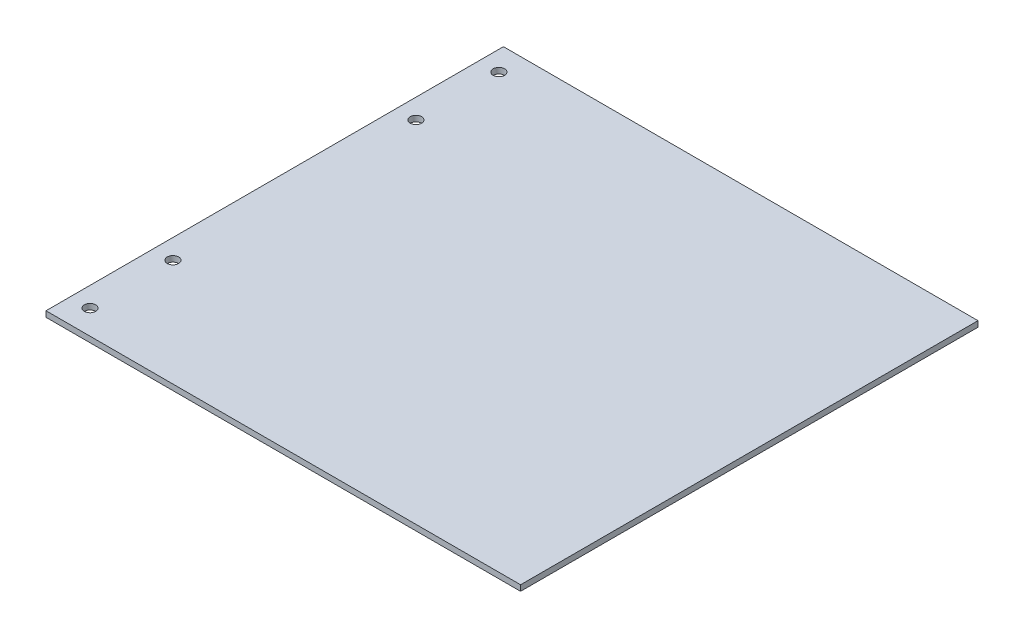
ISO-10303-21;
HEADER;
FILE_DESCRIPTION(('STEP AP214'),'2;1');
FILE_NAME('part.step','',(''),(''),'','','');
FILE_SCHEMA(('AUTOMOTIVE_DESIGN { 1 0 10303 214 1 1 1 1 }'));
ENDSEC;
DATA;
#1=APPLICATION_CONTEXT('core data for automotive mechanical design processes');
#2=APPLICATION_PROTOCOL_DEFINITION('international standard','automotive_design',2000,#1);
#3=PRODUCT_CONTEXT('',#1,'mechanical');
#4=PRODUCT('Part','Part','',(#3));
#5=PRODUCT_RELATED_PRODUCT_CATEGORY('part','',(#4));
#6=PRODUCT_DEFINITION_FORMATION('','',#4);
#7=PRODUCT_DEFINITION_CONTEXT('part definition',#1,'design');
#8=PRODUCT_DEFINITION('design','',#6,#7);
#9=PRODUCT_DEFINITION_SHAPE('','',#8);
#10=(LENGTH_UNIT() NAMED_UNIT(*) SI_UNIT(.MILLI.,.METRE.));
#11=(NAMED_UNIT(*) PLANE_ANGLE_UNIT() SI_UNIT($,.RADIAN.));
#12=(NAMED_UNIT(*) SI_UNIT($,.STERADIAN.) SOLID_ANGLE_UNIT());
#13=UNCERTAINTY_MEASURE_WITH_UNIT(LENGTH_MEASURE(1.E-05),#10,'distance_accuracy_value','');
#14=(GEOMETRIC_REPRESENTATION_CONTEXT(3) GLOBAL_UNCERTAINTY_ASSIGNED_CONTEXT((#13)) GLOBAL_UNIT_ASSIGNED_CONTEXT((#10,
#11,#12)) REPRESENTATION_CONTEXT('',''));
#15=CARTESIAN_POINT('',(0.,0.,0.));
#16=DIRECTION('',(0.,0.,1.));
#17=DIRECTION('',(1.,0.,0.));
#18=AXIS2_PLACEMENT_3D('',#15,#16,#17);
#19=CARTESIAN_POINT('',(-83.,2.,80.));
#20=DIRECTION('',(1.,0.,0.));
#21=DIRECTION('',(0.,0.,-1.));
#22=AXIS2_PLACEMENT_3D('',#19,#20,#21);
#23=PLANE('',#22);
#24=DIRECTION('',(0.,0.,1.));
#25=VECTOR('',#24,1.);
#26=CARTESIAN_POINT('',(-83.,0.,80.));
#27=LINE('',#26,#25);
#28=CARTESIAN_POINT('',(-83.,0.,-80.));
#29=VERTEX_POINT('',#28);
#30=CARTESIAN_POINT('',(-83.,0.,80.));
#31=VERTEX_POINT('',#30);
#32=EDGE_CURVE('E100',#29,#31,#27,.T.);
#33=ORIENTED_EDGE('',*,*,#32,.T.);
#34=DIRECTION('',(0.,-1.,0.));
#35=VECTOR('',#34,1.);
#36=CARTESIAN_POINT('',(-83.,2.,80.));
#37=LINE('',#36,#35);
#38=CARTESIAN_POINT('',(-83.,2.,80.));
#39=VERTEX_POINT('',#38);
#40=EDGE_CURVE('E11',#39,#31,#37,.T.);
#41=ORIENTED_EDGE('',*,*,#40,.F.);
#42=DIRECTION('',(0.,0.,1.));
#43=VECTOR('',#42,1.);
#44=CARTESIAN_POINT('',(-83.,2.,80.));
#45=LINE('',#44,#43);
#46=CARTESIAN_POINT('',(-83.,2.,-80.));
#47=VERTEX_POINT('',#46);
#48=EDGE_CURVE('E87',#47,#39,#45,.T.);
#49=ORIENTED_EDGE('',*,*,#48,.F.);
#50=DIRECTION('',(0.,-1.,0.));
#51=VECTOR('',#50,1.);
#52=CARTESIAN_POINT('',(-83.,2.,-80.));
#53=LINE('',#52,#51);
#54=EDGE_CURVE('E96',#47,#29,#53,.T.);
#55=ORIENTED_EDGE('',*,*,#54,.T.);
#56=EDGE_LOOP('',(#33,#41,#49,#55));
#57=FACE_BOUND('',#56,.T.);
#58=ADVANCED_FACE('F34',(#57),#23,.F.);
#59=CARTESIAN_POINT('',(83.,2.,80.));
#60=DIRECTION('',(0.,0.,-1.));
#61=DIRECTION('',(-1.,0.,0.));
#62=AXIS2_PLACEMENT_3D('',#59,#60,#61);
#63=PLANE('',#62);
#64=DIRECTION('',(1.,0.,0.));
#65=VECTOR('',#64,1.);
#66=CARTESIAN_POINT('',(83.,0.,80.));
#67=LINE('',#66,#65);
#68=CARTESIAN_POINT('',(83.,0.,80.));
#69=VERTEX_POINT('',#68);
#70=EDGE_CURVE('E91',#31,#69,#67,.T.);
#71=ORIENTED_EDGE('',*,*,#70,.T.);
#72=DIRECTION('',(0.,-1.,0.));
#73=VECTOR('',#72,1.);
#74=CARTESIAN_POINT('',(83.,2.,80.));
#75=LINE('',#74,#73);
#76=CARTESIAN_POINT('',(83.,2.,80.));
#77=VERTEX_POINT('',#76);
#78=EDGE_CURVE('E43',#77,#69,#75,.T.);
#79=ORIENTED_EDGE('',*,*,#78,.F.);
#80=DIRECTION('',(1.,0.,0.));
#81=VECTOR('',#80,1.);
#82=CARTESIAN_POINT('',(83.,2.,80.));
#83=LINE('',#82,#81);
#84=EDGE_CURVE('E82',#39,#77,#83,.T.);
#85=ORIENTED_EDGE('',*,*,#84,.F.);
#86=ORIENTED_EDGE('',*,*,#40,.T.);
#87=EDGE_LOOP('',(#71,#79,#85,#86));
#88=FACE_BOUND('',#87,.T.);
#89=ADVANCED_FACE('F90',(#88),#63,.F.);
#90=CARTESIAN_POINT('',(83.,2.,80.));
#91=DIRECTION('',(-1.,0.,0.));
#92=DIRECTION('',(0.,0.,1.));
#93=AXIS2_PLACEMENT_3D('',#90,#91,#92);
#94=PLANE('',#93);
#95=DIRECTION('',(0.,0.,-1.));
#96=VECTOR('',#95,1.);
#97=CARTESIAN_POINT('',(83.,0.,80.));
#98=LINE('',#97,#96);
#99=CARTESIAN_POINT('',(83.,0.,-80.));
#100=VERTEX_POINT('',#99);
#101=EDGE_CURVE('E69',#69,#100,#98,.T.);
#102=ORIENTED_EDGE('',*,*,#101,.T.);
#103=DIRECTION('',(0.,-1.,0.));
#104=VECTOR('',#103,1.);
#105=CARTESIAN_POINT('',(83.,2.,-80.));
#106=LINE('',#105,#104);
#107=CARTESIAN_POINT('',(83.,2.,-80.));
#108=VERTEX_POINT('',#107);
#109=EDGE_CURVE('E92',#108,#100,#106,.T.);
#110=ORIENTED_EDGE('',*,*,#109,.F.);
#111=DIRECTION('',(0.,0.,-1.));
#112=VECTOR('',#111,1.);
#113=CARTESIAN_POINT('',(83.,2.,80.));
#114=LINE('',#113,#112);
#115=EDGE_CURVE('E85',#77,#108,#114,.T.);
#116=ORIENTED_EDGE('',*,*,#115,.F.);
#117=ORIENTED_EDGE('',*,*,#78,.T.);
#118=EDGE_LOOP('',(#102,#110,#116,#117));
#119=FACE_BOUND('',#118,.T.);
#120=ADVANCED_FACE('F94',(#119),#94,.F.);
#121=CARTESIAN_POINT('',(83.,2.,-80.));
#122=DIRECTION('',(0.,0.,1.));
#123=DIRECTION('',(1.,0.,0.));
#124=AXIS2_PLACEMENT_3D('',#121,#122,#123);
#125=PLANE('',#124);
#126=DIRECTION('',(-1.,0.,0.));
#127=VECTOR('',#126,1.);
#128=CARTESIAN_POINT('',(83.,0.,-80.));
#129=LINE('',#128,#127);
#130=EDGE_CURVE('E75',#100,#29,#129,.T.);
#131=ORIENTED_EDGE('',*,*,#130,.T.);
#132=ORIENTED_EDGE('',*,*,#54,.F.);
#133=DIRECTION('',(-1.,0.,0.));
#134=VECTOR('',#133,1.);
#135=CARTESIAN_POINT('',(83.,2.,-80.));
#136=LINE('',#135,#134);
#137=EDGE_CURVE('E52',#108,#47,#136,.T.);
#138=ORIENTED_EDGE('',*,*,#137,.F.);
#139=ORIENTED_EDGE('',*,*,#109,.T.);
#140=EDGE_LOOP('',(#131,#132,#138,#139));
#141=FACE_BOUND('',#140,.T.);
#142=ADVANCED_FACE('F159',(#141),#125,.F.);
#143=CARTESIAN_POINT('',(0.,2.,0.));
#144=DIRECTION('',(0.,1.,0.));
#145=DIRECTION('',(0.,0.,1.));
#146=AXIS2_PLACEMENT_3D('',#143,#144,#145);
#147=PLANE('',#146);
#148=CARTESIAN_POINT('',(-76.0999997082573,2.,71.5000000139421));
#149=DIRECTION('',(0.,1.,0.));
#150=DIRECTION('',(0.,0.,1.));
#151=AXIS2_PLACEMENT_3D('',#148,#149,#150);
#152=CIRCLE('',#151,2.);
#153=CARTESIAN_POINT('',(-76.0999997082573,2.,73.5000000139421));
#154=VERTEX_POINT('',#153);
#155=EDGE_CURVE('E118',#154,#154,#152,.T.);
#156=ORIENTED_EDGE('',*,*,#155,.F.);
#157=EDGE_LOOP('',(#156));
#158=FACE_BOUND('',#157,.T.);
#159=CARTESIAN_POINT('',(-76.0999997082573,2.,42.500000013942));
#160=DIRECTION('',(0.,1.,0.));
#161=DIRECTION('',(0.,0.,1.));
#162=AXIS2_PLACEMENT_3D('',#159,#160,#161);
#163=CIRCLE('',#162,2.);
#164=CARTESIAN_POINT('',(-76.0999997082573,2.,44.5000000139421));
#165=VERTEX_POINT('',#164);
#166=EDGE_CURVE('E115',#165,#165,#163,.T.);
#167=ORIENTED_EDGE('',*,*,#166,.F.);
#168=EDGE_LOOP('',(#167));
#169=FACE_BOUND('',#168,.T.);
#170=CARTESIAN_POINT('',(-76.1000000000025,2.,-42.5000000000026));
#171=DIRECTION('',(0.,1.,0.));
#172=DIRECTION('',(0.,0.,1.));
#173=AXIS2_PLACEMENT_3D('',#170,#171,#172);
#174=CIRCLE('',#173,2.);
#175=CARTESIAN_POINT('',(-76.1000000000025,2.,-40.5000000000026));
#176=VERTEX_POINT('',#175);
#177=EDGE_CURVE('E112',#176,#176,#174,.T.);
#178=ORIENTED_EDGE('',*,*,#177,.F.);
#179=EDGE_LOOP('',(#178));
#180=FACE_BOUND('',#179,.T.);
#181=CARTESIAN_POINT('',(-76.1000000000025,2.,-71.5000000000026));
#182=DIRECTION('',(0.,1.,0.));
#183=DIRECTION('',(0.,0.,1.));
#184=AXIS2_PLACEMENT_3D('',#181,#182,#183);
#185=CIRCLE('',#184,2.);
#186=CARTESIAN_POINT('',(-76.1000000000025,2.,-69.5000000000026));
#187=VERTEX_POINT('',#186);
#188=EDGE_CURVE('E109',#187,#187,#185,.T.);
#189=ORIENTED_EDGE('',*,*,#188,.F.);
#190=EDGE_LOOP('',(#189));
#191=FACE_BOUND('',#190,.T.);
#192=ORIENTED_EDGE('',*,*,#48,.T.);
#193=ORIENTED_EDGE('',*,*,#84,.T.);
#194=ORIENTED_EDGE('',*,*,#115,.T.);
#195=ORIENTED_EDGE('',*,*,#137,.T.);
#196=EDGE_LOOP('',(#192,#193,#194,#195));
#197=FACE_BOUND('',#196,.T.);
#198=ADVANCED_FACE('F83',(#158,#169,#180,#191,#197),#147,.T.);
#199=CARTESIAN_POINT('',(0.,0.,0.));
#200=DIRECTION('',(0.,1.,0.));
#201=DIRECTION('',(0.,0.,1.));
#202=AXIS2_PLACEMENT_3D('',#199,#200,#201);
#203=PLANE('',#202);
#204=CARTESIAN_POINT('',(-76.0999997082573,0.,71.5000000139421));
#205=DIRECTION('',(0.,1.,0.));
#206=DIRECTION('',(0.,0.,1.));
#207=AXIS2_PLACEMENT_3D('',#204,#205,#206);
#208=CIRCLE('',#207,2.);
#209=CARTESIAN_POINT('',(-76.0999997082573,0.,73.5000000139421));
#210=VERTEX_POINT('',#209);
#211=EDGE_CURVE('E37',#210,#210,#208,.T.);
#212=ORIENTED_EDGE('',*,*,#211,.T.);
#213=EDGE_LOOP('',(#212));
#214=FACE_BOUND('',#213,.T.);
#215=CARTESIAN_POINT('',(-76.0999997082573,0.,42.500000013942));
#216=DIRECTION('',(0.,1.,0.));
#217=DIRECTION('',(0.,0.,1.));
#218=AXIS2_PLACEMENT_3D('',#215,#216,#217);
#219=CIRCLE('',#218,2.);
#220=CARTESIAN_POINT('',(-76.0999997082573,0.,44.5000000139421));
#221=VERTEX_POINT('',#220);
#222=EDGE_CURVE('E116',#221,#221,#219,.T.);
#223=ORIENTED_EDGE('',*,*,#222,.T.);
#224=EDGE_LOOP('',(#223));
#225=FACE_BOUND('',#224,.T.);
#226=CARTESIAN_POINT('',(-76.1000000000025,0.,-42.5000000000026));
#227=DIRECTION('',(0.,1.,0.));
#228=DIRECTION('',(0.,0.,1.));
#229=AXIS2_PLACEMENT_3D('',#226,#227,#228);
#230=CIRCLE('',#229,2.);
#231=CARTESIAN_POINT('',(-76.1000000000025,0.,-40.5000000000026));
#232=VERTEX_POINT('',#231);
#233=EDGE_CURVE('E113',#232,#232,#230,.T.);
#234=ORIENTED_EDGE('',*,*,#233,.T.);
#235=EDGE_LOOP('',(#234));
#236=FACE_BOUND('',#235,.T.);
#237=CARTESIAN_POINT('',(-76.1000000000025,0.,-71.5000000000026));
#238=DIRECTION('',(0.,1.,0.));
#239=DIRECTION('',(0.,0.,1.));
#240=AXIS2_PLACEMENT_3D('',#237,#238,#239);
#241=CIRCLE('',#240,2.);
#242=CARTESIAN_POINT('',(-76.1000000000025,0.,-69.5000000000026));
#243=VERTEX_POINT('',#242);
#244=EDGE_CURVE('E103',#243,#243,#241,.T.);
#245=ORIENTED_EDGE('',*,*,#244,.T.);
#246=EDGE_LOOP('',(#245));
#247=FACE_BOUND('',#246,.T.);
#248=ORIENTED_EDGE('',*,*,#32,.F.);
#249=ORIENTED_EDGE('',*,*,#130,.F.);
#250=ORIENTED_EDGE('',*,*,#101,.F.);
#251=ORIENTED_EDGE('',*,*,#70,.F.);
#252=EDGE_LOOP('',(#248,#249,#250,#251));
#253=FACE_BOUND('',#252,.T.);
#254=ADVANCED_FACE('F134',(#214,#225,#236,#247,#253),#203,.F.);
#255=CARTESIAN_POINT('',(-76.1000000000025,2.79999999999552,-71.5000000000026));
#256=DIRECTION('',(0.,1.,0.));
#257=DIRECTION('',(0.,0.,1.));
#258=AXIS2_PLACEMENT_3D('',#255,#256,#257);
#259=CYLINDRICAL_SURFACE('',#258,2.);
#260=ORIENTED_EDGE('',*,*,#188,.T.);
#261=EDGE_LOOP('',(#260));
#262=FACE_BOUND('',#261,.T.);
#263=ORIENTED_EDGE('',*,*,#244,.F.);
#264=EDGE_LOOP('',(#263));
#265=FACE_BOUND('',#264,.T.);
#266=ADVANCED_FACE('F137',(#262,#265),#259,.F.);
#267=CARTESIAN_POINT('',(-76.1000000000025,2.79999999999555,-42.5000000000026));
#268=DIRECTION('',(0.,1.,0.));
#269=DIRECTION('',(0.,0.,1.));
#270=AXIS2_PLACEMENT_3D('',#267,#268,#269);
#271=CYLINDRICAL_SURFACE('',#270,2.);
#272=ORIENTED_EDGE('',*,*,#177,.T.);
#273=EDGE_LOOP('',(#272));
#274=FACE_BOUND('',#273,.T.);
#275=ORIENTED_EDGE('',*,*,#233,.F.);
#276=EDGE_LOOP('',(#275));
#277=FACE_BOUND('',#276,.T.);
#278=ADVANCED_FACE('F139',(#274,#277),#271,.F.);
#279=CARTESIAN_POINT('',(-76.0999997082573,2.79999999999562,42.500000013942));
#280=DIRECTION('',(0.,1.,0.));
#281=DIRECTION('',(0.,0.,1.));
#282=AXIS2_PLACEMENT_3D('',#279,#280,#281);
#283=CYLINDRICAL_SURFACE('',#282,2.);
#284=ORIENTED_EDGE('',*,*,#166,.T.);
#285=EDGE_LOOP('',(#284));
#286=FACE_BOUND('',#285,.T.);
#287=ORIENTED_EDGE('',*,*,#222,.F.);
#288=EDGE_LOOP('',(#287));
#289=FACE_BOUND('',#288,.T.);
#290=ADVANCED_FACE('F146',(#286,#289),#283,.F.);
#291=CARTESIAN_POINT('',(-76.0999997082573,2.79999999999564,71.5000000139421));
#292=DIRECTION('',(0.,1.,0.));
#293=DIRECTION('',(0.,0.,1.));
#294=AXIS2_PLACEMENT_3D('',#291,#292,#293);
#295=CYLINDRICAL_SURFACE('',#294,2.);
#296=ORIENTED_EDGE('',*,*,#155,.T.);
#297=EDGE_LOOP('',(#296));
#298=FACE_BOUND('',#297,.T.);
#299=ORIENTED_EDGE('',*,*,#211,.F.);
#300=EDGE_LOOP('',(#299));
#301=FACE_BOUND('',#300,.T.);
#302=ADVANCED_FACE('F212',(#298,#301),#295,.F.);
#303=CLOSED_SHELL('',(#58,#89,#120,#142,#198,#254,#266,#278,#290,#302));
#304=MANIFOLD_SOLID_BREP('B2',#303);
#305=ADVANCED_BREP_SHAPE_REPRESENTATION('',(#18,#304),#14);
#306=SHAPE_DEFINITION_REPRESENTATION(#9,#305);
ENDSEC;
END-ISO-10303-21;
